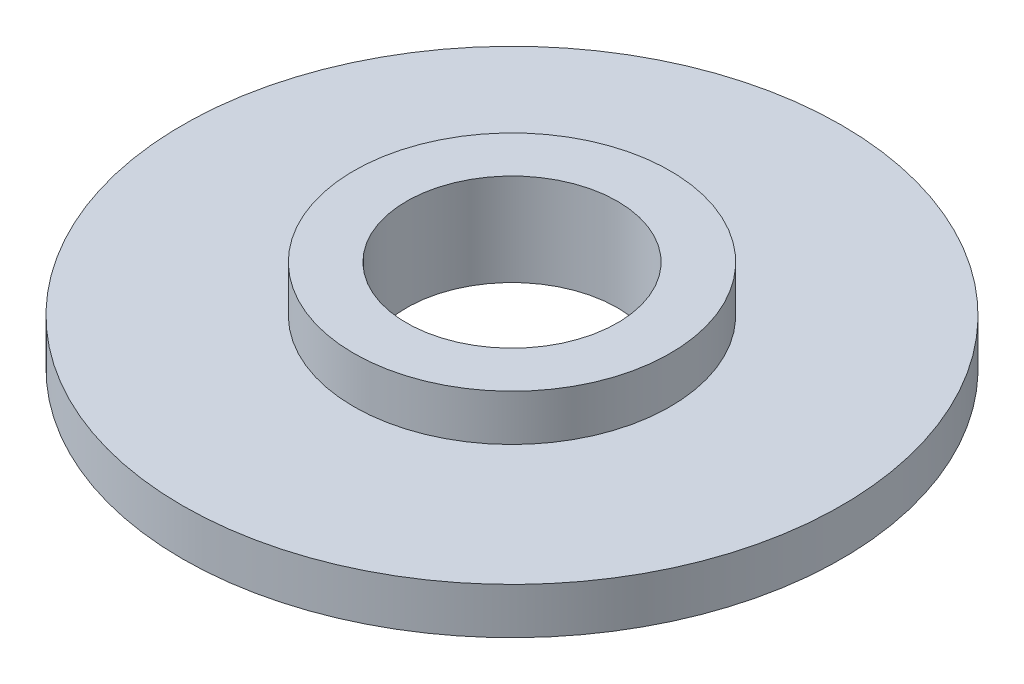
ISO-10303-21;
HEADER;
FILE_DESCRIPTION(('STEP AP214'),'2;1');
FILE_NAME('part.step','',(''),(''),'','','');
FILE_SCHEMA(('AUTOMOTIVE_DESIGN { 1 0 10303 214 1 1 1 1 }'));
ENDSEC;
DATA;
#1=APPLICATION_CONTEXT('core data for automotive mechanical design processes');
#2=APPLICATION_PROTOCOL_DEFINITION('international standard','automotive_design',2000,#1);
#3=PRODUCT_CONTEXT('',#1,'mechanical');
#4=PRODUCT('Part','Part','',(#3));
#5=PRODUCT_RELATED_PRODUCT_CATEGORY('part','',(#4));
#6=PRODUCT_DEFINITION_FORMATION('','',#4);
#7=PRODUCT_DEFINITION_CONTEXT('part definition',#1,'design');
#8=PRODUCT_DEFINITION('design','',#6,#7);
#9=PRODUCT_DEFINITION_SHAPE('','',#8);
#10=(LENGTH_UNIT() NAMED_UNIT(*) SI_UNIT(.MILLI.,.METRE.));
#11=(NAMED_UNIT(*) PLANE_ANGLE_UNIT() SI_UNIT($,.RADIAN.));
#12=(NAMED_UNIT(*) SI_UNIT($,.STERADIAN.) SOLID_ANGLE_UNIT());
#13=UNCERTAINTY_MEASURE_WITH_UNIT(LENGTH_MEASURE(1.E-05),#10,'distance_accuracy_value','');
#14=(GEOMETRIC_REPRESENTATION_CONTEXT(3) GLOBAL_UNCERTAINTY_ASSIGNED_CONTEXT((#13)) GLOBAL_UNIT_ASSIGNED_CONTEXT((#10,
#11,#12)) REPRESENTATION_CONTEXT('',''));
#15=CARTESIAN_POINT('',(0.,0.,0.));
#16=DIRECTION('',(0.,0.,1.));
#17=DIRECTION('',(1.,0.,0.));
#18=AXIS2_PLACEMENT_3D('',#15,#16,#17);
#19=CARTESIAN_POINT('',(0.,3.5,0.));
#20=DIRECTION('',(0.,1.,0.));
#21=DIRECTION('',(0.,0.,1.));
#22=AXIS2_PLACEMENT_3D('',#19,#20,#21);
#23=PLANE('',#22);
#24=CARTESIAN_POINT('',(0.,3.5,0.));
#25=DIRECTION('',(0.,1.,0.));
#26=DIRECTION('',(0.,0.,1.));
#27=AXIS2_PLACEMENT_3D('',#24,#25,#26);
#28=CIRCLE('',#27,4.);
#29=CARTESIAN_POINT('',(0.,3.5,-4.));
#30=VERTEX_POINT('',#29);
#31=EDGE_CURVE('E45',#30,#30,#28,.T.);
#32=ORIENTED_EDGE('',*,*,#31,.F.);
#33=EDGE_LOOP('',(#32));
#34=FACE_BOUND('',#33,.T.);
#35=CARTESIAN_POINT('',(0.,3.5,0.));
#36=DIRECTION('',(0.,1.,0.));
#37=DIRECTION('',(0.,0.,1.));
#38=AXIS2_PLACEMENT_3D('',#35,#36,#37);
#39=CIRCLE('',#38,6.);
#40=CARTESIAN_POINT('',(0.,3.5,6.));
#41=VERTEX_POINT('',#40);
#42=EDGE_CURVE('E59',#41,#41,#39,.T.);
#43=ORIENTED_EDGE('',*,*,#42,.T.);
#44=EDGE_LOOP('',(#43));
#45=FACE_BOUND('',#44,.T.);
#46=ADVANCED_FACE('F38',(#34,#45),#23,.T.);
#47=CARTESIAN_POINT('',(0.,3.5,0.));
#48=DIRECTION('',(0.,-1.,0.));
#49=DIRECTION('',(0.,0.,-1.));
#50=AXIS2_PLACEMENT_3D('',#47,#48,#49);
#51=CYLINDRICAL_SURFACE('',#50,12.5);
#52=CARTESIAN_POINT('',(0.,0.,0.));
#53=DIRECTION('',(0.,1.,0.));
#54=DIRECTION('',(0.,0.,1.));
#55=AXIS2_PLACEMENT_3D('',#52,#53,#54);
#56=CIRCLE('',#55,12.5);
#57=CARTESIAN_POINT('',(0.,0.,-12.5));
#58=VERTEX_POINT('',#57);
#59=EDGE_CURVE('E10',#58,#58,#56,.T.);
#60=CARTESIAN_POINT('',(0.,1.75,0.));
#61=DIRECTION('',(0.,1.,0.));
#62=DIRECTION('',(0.,0.,1.));
#63=AXIS2_PLACEMENT_3D('',#60,#61,#62);
#64=CIRCLE('',#63,12.5);
#65=CARTESIAN_POINT('',(0.,1.75,-12.5));
#66=VERTEX_POINT('',#65);
#67=EDGE_CURVE('E54',#66,#66,#64,.T.);
#68=CARTESIAN_POINT('',(0.,0.,-12.5));
#69=CARTESIAN_POINT('',(0.,0.0182291666666662,-12.5));
#70=CARTESIAN_POINT('',(0.,0.0364583333333329,-12.5));
#71=CARTESIAN_POINT('',(0.,0.0729166666666663,-12.5));
#72=CARTESIAN_POINT('',(0.,0.091145833333333,-12.5));
#73=CARTESIAN_POINT('',(0.,0.127604166666666,-12.5));
#74=CARTESIAN_POINT('',(0.,0.145833333333333,-12.5));
#75=CARTESIAN_POINT('',(0.,0.182291666666666,-12.5));
#76=CARTESIAN_POINT('',(0.,0.200520833333333,-12.5));
#77=CARTESIAN_POINT('',(0.,0.236979166666666,-12.5));
#78=CARTESIAN_POINT('',(0.,0.255208333333333,-12.5));
#79=CARTESIAN_POINT('',(0.,0.291666666666666,-12.5));
#80=CARTESIAN_POINT('',(0.,0.309895833333333,-12.5));
#81=CARTESIAN_POINT('',(0.,0.346354166666666,-12.5));
#82=CARTESIAN_POINT('',(0.,0.364583333333333,-12.5));
#83=CARTESIAN_POINT('',(0.,0.401041666666666,-12.5));
#84=CARTESIAN_POINT('',(0.,0.419270833333333,-12.5));
#85=CARTESIAN_POINT('',(0.,0.455729166666666,-12.5));
#86=CARTESIAN_POINT('',(0.,0.473958333333333,-12.5));
#87=CARTESIAN_POINT('',(0.,0.510416666666666,-12.5));
#88=CARTESIAN_POINT('',(0.,0.528645833333333,-12.5));
#89=CARTESIAN_POINT('',(0.,0.565104166666666,-12.5));
#90=CARTESIAN_POINT('',(0.,0.583333333333333,-12.5));
#91=CARTESIAN_POINT('',(0.,0.619791666666666,-12.5));
#92=CARTESIAN_POINT('',(0.,0.638020833333333,-12.5));
#93=CARTESIAN_POINT('',(0.,0.674479166666666,-12.5));
#94=CARTESIAN_POINT('',(0.,0.692708333333333,-12.5));
#95=CARTESIAN_POINT('',(0.,0.729166666666667,-12.5));
#96=CARTESIAN_POINT('',(0.,0.747395833333333,-12.5));
#97=CARTESIAN_POINT('',(0.,0.783854166666666,-12.5));
#98=CARTESIAN_POINT('',(0.,0.802083333333333,-12.5));
#99=CARTESIAN_POINT('',(0.,0.838541666666666,-12.5));
#100=CARTESIAN_POINT('',(0.,0.856770833333333,-12.5));
#101=CARTESIAN_POINT('',(0.,0.893229166666666,-12.5));
#102=CARTESIAN_POINT('',(0.,0.911458333333333,-12.5));
#103=CARTESIAN_POINT('',(0.,0.947916666666666,-12.5));
#104=CARTESIAN_POINT('',(0.,0.966145833333333,-12.5));
#105=CARTESIAN_POINT('',(0.,1.00260416666667,-12.5));
#106=CARTESIAN_POINT('',(0.,1.02083333333333,-12.5));
#107=CARTESIAN_POINT('',(0.,1.05729166666667,-12.5));
#108=CARTESIAN_POINT('',(0.,1.07552083333333,-12.5));
#109=CARTESIAN_POINT('',(0.,1.11197916666667,-12.5));
#110=CARTESIAN_POINT('',(0.,1.13020833333333,-12.5));
#111=CARTESIAN_POINT('',(0.,1.16666666666667,-12.5));
#112=CARTESIAN_POINT('',(0.,1.18489583333333,-12.5));
#113=CARTESIAN_POINT('',(0.,1.22135416666667,-12.5));
#114=CARTESIAN_POINT('',(0.,1.23958333333333,-12.5));
#115=CARTESIAN_POINT('',(0.,1.27604166666667,-12.5));
#116=CARTESIAN_POINT('',(0.,1.29427083333333,-12.5));
#117=CARTESIAN_POINT('',(0.,1.33072916666667,-12.5));
#118=CARTESIAN_POINT('',(0.,1.34895833333333,-12.5));
#119=CARTESIAN_POINT('',(0.,1.38541666666667,-12.5));
#120=CARTESIAN_POINT('',(0.,1.40364583333333,-12.5));
#121=CARTESIAN_POINT('',(0.,1.44010416666667,-12.5));
#122=CARTESIAN_POINT('',(0.,1.45833333333333,-12.5));
#123=CARTESIAN_POINT('',(0.,1.49479166666667,-12.5));
#124=CARTESIAN_POINT('',(0.,1.51302083333333,-12.5));
#125=CARTESIAN_POINT('',(0.,1.54947916666667,-12.5));
#126=CARTESIAN_POINT('',(0.,1.56770833333333,-12.5));
#127=CARTESIAN_POINT('',(0.,1.60416666666667,-12.5));
#128=CARTESIAN_POINT('',(0.,1.62239583333333,-12.5));
#129=CARTESIAN_POINT('',(0.,1.65885416666667,-12.5));
#130=CARTESIAN_POINT('',(0.,1.67708333333333,-12.5));
#131=CARTESIAN_POINT('',(0.,1.71354166666667,-12.5));
#132=CARTESIAN_POINT('',(0.,1.73177083333333,-12.5));
#133=CARTESIAN_POINT('',(0.,1.75,-12.5));
#134=B_SPLINE_CURVE_WITH_KNOTS('',3,(#68,#69,#70,#71,#72,#73,#74,#75,#76,#77,#78,#79,#80,#81,
#82,#83,#84,#85,#86,#87,#88,#89,#90,#91,#92,#93,#94,#95,#96,#97,#98,#99,#100,#101,#102,#103,
#104,#105,#106,#107,#108,#109,#110,#111,#112,#113,#114,#115,#116,#117,#118,#119,#120,#121,#122,
#123,#124,#125,#126,#127,#128,#129,#130,#131,#132,#133),.UNSPECIFIED.,.F.,.F.,(4,2,2,2,2,2,2,2,
2,2,2,2,2,2,2,2,2,2,2,2,2,2,2,2,2,2,2,2,2,2,2,2,4),(0.,0.0546875,0.109375,0.1640625,0.21875,
0.2734375,0.328125,0.3828125,0.4375,0.4921875,0.546875,0.6015625,0.65625,0.7109375,0.765625,
0.8203125,0.875,0.9296875,0.984375,1.0390625,1.09375,1.1484375,1.203125,1.2578125,1.3125,
1.3671875,1.421875,1.4765625,1.53125,1.5859375,1.640625,1.6953125,1.75),.UNSPECIFIED.);
#135=EDGE_CURVE('BSEAM40',#58,#66,#134,.T.);
#136=ORIENTED_EDGE('',*,*,#59,.T.);
#137=ORIENTED_EDGE('',*,*,#67,.F.);
#138=ORIENTED_EDGE('',*,*,#135,.T.);
#139=ORIENTED_EDGE('',*,*,#135,.F.);
#140=EDGE_LOOP('',(#136,#138,#137,#139));
#141=FACE_BOUND('',#140,.T.);
#142=ADVANCED_FACE('F40',(#141),#51,.T.);
#143=CARTESIAN_POINT('',(0.,0.,0.));
#144=DIRECTION('',(0.,1.,0.));
#145=DIRECTION('',(0.,0.,1.));
#146=AXIS2_PLACEMENT_3D('',#143,#144,#145);
#147=PLANE('',#146);
#148=ORIENTED_EDGE('',*,*,#59,.F.);
#149=EDGE_LOOP('',(#148));
#150=FACE_BOUND('',#149,.T.);
#151=CARTESIAN_POINT('',(0.,0.,0.));
#152=DIRECTION('',(0.,1.,0.));
#153=DIRECTION('',(0.,0.,1.));
#154=AXIS2_PLACEMENT_3D('',#151,#152,#153);
#155=CIRCLE('',#154,4.);
#156=CARTESIAN_POINT('',(0.,0.,-4.));
#157=VERTEX_POINT('',#156);
#158=EDGE_CURVE('E49',#157,#157,#155,.T.);
#159=ORIENTED_EDGE('',*,*,#158,.T.);
#160=EDGE_LOOP('',(#159));
#161=FACE_BOUND('',#160,.T.);
#162=ADVANCED_FACE('F76',(#150,#161),#147,.F.);
#163=CARTESIAN_POINT('',(0.,3.5,0.));
#164=DIRECTION('',(0.,-1.,0.));
#165=DIRECTION('',(0.,0.,-1.));
#166=AXIS2_PLACEMENT_3D('',#163,#164,#165);
#167=CYLINDRICAL_SURFACE('',#166,4.);
#168=CARTESIAN_POINT('',(0.,3.5,-4.));
#169=CARTESIAN_POINT('',(0.,3.46354166666667,-4.));
#170=CARTESIAN_POINT('',(0.,3.42708333333333,-4.));
#171=CARTESIAN_POINT('',(0.,3.35416666666667,-4.));
#172=CARTESIAN_POINT('',(0.,3.31770833333333,-4.));
#173=CARTESIAN_POINT('',(0.,3.24479166666667,-4.));
#174=CARTESIAN_POINT('',(0.,3.20833333333333,-4.));
#175=CARTESIAN_POINT('',(0.,3.13541666666667,-4.));
#176=CARTESIAN_POINT('',(0.,3.09895833333333,-4.));
#177=CARTESIAN_POINT('',(0.,3.02604166666667,-4.));
#178=CARTESIAN_POINT('',(0.,2.98958333333333,-4.));
#179=CARTESIAN_POINT('',(0.,2.91666666666667,-4.));
#180=CARTESIAN_POINT('',(0.,2.88020833333333,-4.));
#181=CARTESIAN_POINT('',(0.,2.80729166666667,-4.));
#182=CARTESIAN_POINT('',(0.,2.77083333333333,-4.));
#183=CARTESIAN_POINT('',(0.,2.69791666666667,-4.));
#184=CARTESIAN_POINT('',(0.,2.66145833333333,-4.));
#185=CARTESIAN_POINT('',(0.,2.58854166666667,-4.));
#186=CARTESIAN_POINT('',(0.,2.55208333333333,-4.));
#187=CARTESIAN_POINT('',(0.,2.47916666666667,-4.));
#188=CARTESIAN_POINT('',(0.,2.44270833333333,-4.));
#189=CARTESIAN_POINT('',(0.,2.36979166666667,-4.));
#190=CARTESIAN_POINT('',(0.,2.33333333333333,-4.));
#191=CARTESIAN_POINT('',(0.,2.26041666666667,-4.));
#192=CARTESIAN_POINT('',(0.,2.22395833333333,-4.));
#193=CARTESIAN_POINT('',(0.,2.15104166666667,-4.));
#194=CARTESIAN_POINT('',(0.,2.11458333333333,-4.));
#195=CARTESIAN_POINT('',(0.,2.04166666666667,-4.));
#196=CARTESIAN_POINT('',(0.,2.00520833333333,-4.));
#197=CARTESIAN_POINT('',(0.,1.93229166666667,-4.));
#198=CARTESIAN_POINT('',(0.,1.89583333333333,-4.));
#199=CARTESIAN_POINT('',(0.,1.82291666666667,-4.));
#200=CARTESIAN_POINT('',(0.,1.78645833333333,-4.));
#201=CARTESIAN_POINT('',(0.,1.71354166666667,-4.));
#202=CARTESIAN_POINT('',(0.,1.67708333333333,-4.));
#203=CARTESIAN_POINT('',(0.,1.60416666666667,-4.));
#204=CARTESIAN_POINT('',(0.,1.56770833333333,-4.));
#205=CARTESIAN_POINT('',(0.,1.49479166666667,-4.));
#206=CARTESIAN_POINT('',(0.,1.45833333333333,-4.));
#207=CARTESIAN_POINT('',(0.,1.38541666666667,-4.));
#208=CARTESIAN_POINT('',(0.,1.34895833333333,-4.));
#209=CARTESIAN_POINT('',(0.,1.27604166666667,-4.));
#210=CARTESIAN_POINT('',(0.,1.23958333333333,-4.));
#211=CARTESIAN_POINT('',(0.,1.16666666666667,-4.));
#212=CARTESIAN_POINT('',(0.,1.13020833333333,-4.));
#213=CARTESIAN_POINT('',(0.,1.05729166666667,-4.));
#214=CARTESIAN_POINT('',(0.,1.02083333333333,-4.));
#215=CARTESIAN_POINT('',(0.,0.947916666666666,-4.));
#216=CARTESIAN_POINT('',(0.,0.911458333333333,-4.));
#217=CARTESIAN_POINT('',(0.,0.838541666666666,-4.));
#218=CARTESIAN_POINT('',(0.,0.802083333333333,-4.));
#219=CARTESIAN_POINT('',(0.,0.729166666666666,-4.));
#220=CARTESIAN_POINT('',(0.,0.692708333333333,-4.));
#221=CARTESIAN_POINT('',(0.,0.619791666666666,-4.));
#222=CARTESIAN_POINT('',(0.,0.583333333333333,-4.));
#223=CARTESIAN_POINT('',(0.,0.510416666666666,-4.));
#224=CARTESIAN_POINT('',(0.,0.473958333333333,-4.));
#225=CARTESIAN_POINT('',(0.,0.401041666666666,-4.));
#226=CARTESIAN_POINT('',(0.,0.364583333333333,-4.));
#227=CARTESIAN_POINT('',(0.,0.291666666666666,-4.));
#228=CARTESIAN_POINT('',(0.,0.255208333333333,-4.));
#229=CARTESIAN_POINT('',(0.,0.182291666666666,-4.));
#230=CARTESIAN_POINT('',(0.,0.145833333333333,-4.));
#231=CARTESIAN_POINT('',(0.,0.0729166666666663,-4.));
#232=CARTESIAN_POINT('',(0.,0.0364583333333329,-4.));
#233=CARTESIAN_POINT('',(0.,0.,-4.));
#234=B_SPLINE_CURVE_WITH_KNOTS('',3,(#168,#169,#170,#171,#172,#173,#174,#175,#176,#177,#178,
#179,#180,#181,#182,#183,#184,#185,#186,#187,#188,#189,#190,#191,#192,#193,#194,#195,#196,#197,
#198,#199,#200,#201,#202,#203,#204,#205,#206,#207,#208,#209,#210,#211,#212,#213,#214,#215,#216,
#217,#218,#219,#220,#221,#222,#223,#224,#225,#226,#227,#228,#229,#230,#231,#232,#233),
.UNSPECIFIED.,.F.,.F.,(4,2,2,2,2,2,2,2,2,2,2,2,2,2,2,2,2,2,2,2,2,2,2,2,2,2,2,2,2,2,2,2,4),(0.,
0.109375,0.21875,0.328125,0.4375,0.546875,0.65625,0.765625,0.874999999999999,0.984375,1.09375,
1.203125,1.3125,1.421875,1.53125,1.640625,1.75,1.859375,1.96875,2.078125,2.1875,2.296875,
2.40625,2.515625,2.625,2.734375,2.84375,2.953125,3.0625,3.171875,3.28125,3.390625,3.5),.UNSPECIFIED.);
#235=EDGE_CURVE('BSEAM71',#30,#157,#234,.T.);
#236=ORIENTED_EDGE('',*,*,#31,.T.);
#237=ORIENTED_EDGE('',*,*,#158,.F.);
#238=ORIENTED_EDGE('',*,*,#235,.T.);
#239=ORIENTED_EDGE('',*,*,#235,.F.);
#240=EDGE_LOOP('',(#236,#238,#237,#239));
#241=FACE_BOUND('',#240,.T.);
#242=ADVANCED_FACE('F71',(#241),#167,.F.);
#243=CARTESIAN_POINT('',(0.,1.75,0.));
#244=DIRECTION('',(0.,1.,0.));
#245=DIRECTION('',(0.,0.,1.));
#246=AXIS2_PLACEMENT_3D('',#243,#244,#245);
#247=PLANE('',#246);
#248=CARTESIAN_POINT('',(0.,1.75,0.));
#249=DIRECTION('',(0.,1.,0.));
#250=DIRECTION('',(0.,0.,1.));
#251=AXIS2_PLACEMENT_3D('',#248,#249,#250);
#252=CIRCLE('',#251,6.);
#253=CARTESIAN_POINT('',(0.,1.75,6.));
#254=VERTEX_POINT('',#253);
#255=EDGE_CURVE('E58',#254,#254,#252,.T.);
#256=ORIENTED_EDGE('',*,*,#255,.F.);
#257=EDGE_LOOP('',(#256));
#258=FACE_BOUND('',#257,.T.);
#259=ORIENTED_EDGE('',*,*,#67,.T.);
#260=EDGE_LOOP('',(#259));
#261=FACE_BOUND('',#260,.T.);
#262=ADVANCED_FACE('F68',(#258,#261),#247,.T.);
#263=CARTESIAN_POINT('',(0.,1.75,0.));
#264=DIRECTION('',(0.,1.,0.));
#265=DIRECTION('',(0.,0.,1.));
#266=AXIS2_PLACEMENT_3D('',#263,#264,#265);
#267=CYLINDRICAL_SURFACE('',#266,6.);
#268=CARTESIAN_POINT('',(0.,1.75,6.));
#269=CARTESIAN_POINT('',(0.,1.76822916666667,6.));
#270=CARTESIAN_POINT('',(0.,1.78645833333333,6.));
#271=CARTESIAN_POINT('',(0.,1.82291666666667,6.));
#272=CARTESIAN_POINT('',(0.,1.84114583333333,6.));
#273=CARTESIAN_POINT('',(0.,1.87760416666667,6.));
#274=CARTESIAN_POINT('',(0.,1.89583333333333,6.));
#275=CARTESIAN_POINT('',(0.,1.93229166666667,6.));
#276=CARTESIAN_POINT('',(0.,1.95052083333333,6.));
#277=CARTESIAN_POINT('',(0.,1.98697916666667,6.));
#278=CARTESIAN_POINT('',(0.,2.00520833333333,6.));
#279=CARTESIAN_POINT('',(0.,2.04166666666667,6.));
#280=CARTESIAN_POINT('',(0.,2.05989583333333,6.));
#281=CARTESIAN_POINT('',(0.,2.09635416666667,6.));
#282=CARTESIAN_POINT('',(0.,2.11458333333333,6.));
#283=CARTESIAN_POINT('',(0.,2.15104166666667,6.));
#284=CARTESIAN_POINT('',(0.,2.16927083333333,6.));
#285=CARTESIAN_POINT('',(0.,2.20572916666667,6.));
#286=CARTESIAN_POINT('',(0.,2.22395833333333,6.));
#287=CARTESIAN_POINT('',(0.,2.26041666666667,6.));
#288=CARTESIAN_POINT('',(0.,2.27864583333333,6.));
#289=CARTESIAN_POINT('',(0.,2.31510416666667,6.));
#290=CARTESIAN_POINT('',(0.,2.33333333333333,6.));
#291=CARTESIAN_POINT('',(0.,2.36979166666667,6.));
#292=CARTESIAN_POINT('',(0.,2.38802083333333,6.));
#293=CARTESIAN_POINT('',(0.,2.42447916666667,6.));
#294=CARTESIAN_POINT('',(0.,2.44270833333333,6.));
#295=CARTESIAN_POINT('',(0.,2.47916666666667,6.));
#296=CARTESIAN_POINT('',(0.,2.49739583333333,6.));
#297=CARTESIAN_POINT('',(0.,2.53385416666667,6.));
#298=CARTESIAN_POINT('',(0.,2.55208333333333,6.));
#299=CARTESIAN_POINT('',(0.,2.58854166666667,6.));
#300=CARTESIAN_POINT('',(0.,2.60677083333333,6.));
#301=CARTESIAN_POINT('',(0.,2.64322916666667,6.));
#302=CARTESIAN_POINT('',(0.,2.66145833333333,6.));
#303=CARTESIAN_POINT('',(0.,2.69791666666667,6.));
#304=CARTESIAN_POINT('',(0.,2.71614583333333,6.));
#305=CARTESIAN_POINT('',(0.,2.75260416666667,6.));
#306=CARTESIAN_POINT('',(0.,2.77083333333333,6.));
#307=CARTESIAN_POINT('',(0.,2.80729166666667,6.));
#308=CARTESIAN_POINT('',(0.,2.82552083333333,6.));
#309=CARTESIAN_POINT('',(0.,2.86197916666667,6.));
#310=CARTESIAN_POINT('',(0.,2.88020833333333,6.));
#311=CARTESIAN_POINT('',(0.,2.91666666666667,6.));
#312=CARTESIAN_POINT('',(0.,2.93489583333333,6.));
#313=CARTESIAN_POINT('',(0.,2.97135416666667,6.));
#314=CARTESIAN_POINT('',(0.,2.98958333333333,6.));
#315=CARTESIAN_POINT('',(0.,3.02604166666667,6.));
#316=CARTESIAN_POINT('',(0.,3.04427083333333,6.));
#317=CARTESIAN_POINT('',(0.,3.08072916666667,6.));
#318=CARTESIAN_POINT('',(0.,3.09895833333333,6.));
#319=CARTESIAN_POINT('',(0.,3.13541666666667,6.));
#320=CARTESIAN_POINT('',(0.,3.15364583333333,6.));
#321=CARTESIAN_POINT('',(0.,3.19010416666667,6.));
#322=CARTESIAN_POINT('',(0.,3.20833333333333,6.));
#323=CARTESIAN_POINT('',(0.,3.24479166666667,6.));
#324=CARTESIAN_POINT('',(0.,3.26302083333333,6.));
#325=CARTESIAN_POINT('',(0.,3.29947916666667,6.));
#326=CARTESIAN_POINT('',(0.,3.31770833333333,6.));
#327=CARTESIAN_POINT('',(0.,3.35416666666667,6.));
#328=CARTESIAN_POINT('',(0.,3.37239583333333,6.));
#329=CARTESIAN_POINT('',(0.,3.40885416666667,6.));
#330=CARTESIAN_POINT('',(0.,3.42708333333333,6.));
#331=CARTESIAN_POINT('',(0.,3.46354166666667,6.));
#332=CARTESIAN_POINT('',(0.,3.48177083333333,6.));
#333=CARTESIAN_POINT('',(0.,3.5,6.));
#334=B_SPLINE_CURVE_WITH_KNOTS('',3,(#268,#269,#270,#271,#272,#273,#274,#275,#276,#277,#278,
#279,#280,#281,#282,#283,#284,#285,#286,#287,#288,#289,#290,#291,#292,#293,#294,#295,#296,#297,
#298,#299,#300,#301,#302,#303,#304,#305,#306,#307,#308,#309,#310,#311,#312,#313,#314,#315,#316,
#317,#318,#319,#320,#321,#322,#323,#324,#325,#326,#327,#328,#329,#330,#331,#332,#333),
.UNSPECIFIED.,.F.,.F.,(4,2,2,2,2,2,2,2,2,2,2,2,2,2,2,2,2,2,2,2,2,2,2,2,2,2,2,2,2,2,2,2,4),(0.,
0.0546874999999998,0.109375,0.1640625,0.21875,0.2734375,0.328125,0.3828125,0.4375,0.4921875,
0.546875,0.6015625,0.65625,0.7109375,0.765625,0.8203125,0.875,0.9296875,0.984375,1.0390625,
1.09375,1.1484375,1.203125,1.2578125,1.3125,1.3671875,1.421875,1.4765625,1.53125,1.5859375,
1.640625,1.6953125,1.75),.UNSPECIFIED.);
#335=EDGE_CURVE('BSEAM65',#254,#41,#334,.T.);
#336=ORIENTED_EDGE('',*,*,#255,.T.);
#337=ORIENTED_EDGE('',*,*,#42,.F.);
#338=ORIENTED_EDGE('',*,*,#335,.T.);
#339=ORIENTED_EDGE('',*,*,#335,.F.);
#340=EDGE_LOOP('',(#336,#338,#337,#339));
#341=FACE_BOUND('',#340,.T.);
#342=ADVANCED_FACE('F65',(#341),#267,.T.);
#343=CLOSED_SHELL('',(#46,#142,#162,#242,#262,#342));
#344=MANIFOLD_SOLID_BREP('B2',#343);
#345=ADVANCED_BREP_SHAPE_REPRESENTATION('',(#18,#344),#14);
#346=SHAPE_DEFINITION_REPRESENTATION(#9,#345);
ENDSEC;
END-ISO-10303-21;
